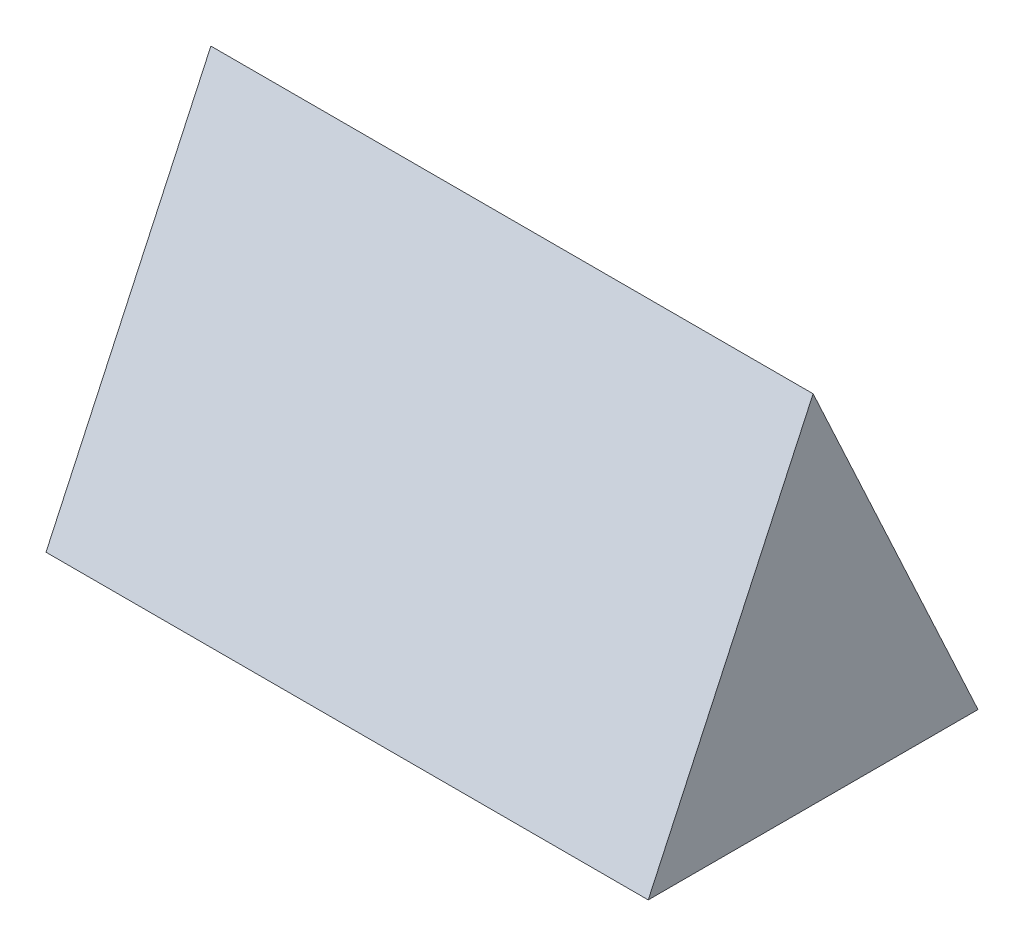
ISO-10303-21;
HEADER;
FILE_DESCRIPTION(('STEP AP214'),'2;1');
FILE_NAME('part.step','',(''),(''),'','','');
FILE_SCHEMA(('AUTOMOTIVE_DESIGN { 1 0 10303 214 1 1 1 1 }'));
ENDSEC;
DATA;
#1=APPLICATION_CONTEXT('core data for automotive mechanical design processes');
#2=APPLICATION_PROTOCOL_DEFINITION('international standard','automotive_design',2000,#1);
#3=PRODUCT_CONTEXT('',#1,'mechanical');
#4=PRODUCT('Part','Part','',(#3));
#5=PRODUCT_RELATED_PRODUCT_CATEGORY('part','',(#4));
#6=PRODUCT_DEFINITION_FORMATION('','',#4);
#7=PRODUCT_DEFINITION_CONTEXT('part definition',#1,'design');
#8=PRODUCT_DEFINITION('design','',#6,#7);
#9=PRODUCT_DEFINITION_SHAPE('','',#8);
#10=(LENGTH_UNIT() NAMED_UNIT(*) SI_UNIT(.MILLI.,.METRE.));
#11=(NAMED_UNIT(*) PLANE_ANGLE_UNIT() SI_UNIT($,.RADIAN.));
#12=(NAMED_UNIT(*) SI_UNIT($,.STERADIAN.) SOLID_ANGLE_UNIT());
#13=UNCERTAINTY_MEASURE_WITH_UNIT(LENGTH_MEASURE(1.E-05),#10,'distance_accuracy_value','');
#14=(GEOMETRIC_REPRESENTATION_CONTEXT(3) GLOBAL_UNCERTAINTY_ASSIGNED_CONTEXT((#13)) GLOBAL_UNIT_ASSIGNED_CONTEXT((#10,
#11,#12)) REPRESENTATION_CONTEXT('',''));
#15=CARTESIAN_POINT('',(0.,0.,0.));
#16=DIRECTION('',(0.,0.,1.));
#17=DIRECTION('',(1.,0.,0.));
#18=AXIS2_PLACEMENT_3D('',#15,#16,#17);
#19=CARTESIAN_POINT('',(-147.,-31.0214859437751,0.));
#20=DIRECTION('',(0.,-1.,0.));
#21=DIRECTION('',(0.,0.,-1.));
#22=AXIS2_PLACEMENT_3D('',#19,#20,#21);
#23=PLANE('',#22);
#24=DIRECTION('',(1.,0.,0.));
#25=VECTOR('',#24,1.);
#26=CARTESIAN_POINT('',(-147.,-31.0214859437751,-75.));
#27=LINE('',#26,#25);
#28=CARTESIAN_POINT('',(-147.,-31.0214859437751,-75.));
#29=VERTEX_POINT('',#28);
#30=CARTESIAN_POINT('',(126.95,-31.0214859437751,-75.));
#31=VERTEX_POINT('',#30);
#32=EDGE_CURVE('E37',#29,#31,#27,.T.);
#33=ORIENTED_EDGE('',*,*,#32,.T.);
#34=DIRECTION('',(0.,0.,-1.));
#35=VECTOR('',#34,1.);
#36=CARTESIAN_POINT('',(126.95,-31.0214859437751,0.));
#37=LINE('',#36,#35);
#38=CARTESIAN_POINT('',(126.95,-31.0214859437751,75.));
#39=VERTEX_POINT('',#38);
#40=EDGE_CURVE('E71',#39,#31,#37,.T.);
#41=ORIENTED_EDGE('',*,*,#40,.F.);
#42=DIRECTION('',(1.,0.,0.));
#43=VECTOR('',#42,1.);
#44=CARTESIAN_POINT('',(-147.,-31.0214859437751,75.));
#45=LINE('',#44,#43);
#46=CARTESIAN_POINT('',(-147.,-31.0214859437751,75.));
#47=VERTEX_POINT('',#46);
#48=EDGE_CURVE('E11',#47,#39,#45,.T.);
#49=ORIENTED_EDGE('',*,*,#48,.F.);
#50=DIRECTION('',(0.,0.,-1.));
#51=VECTOR('',#50,1.);
#52=CARTESIAN_POINT('',(-147.,-31.0214859437751,0.));
#53=LINE('',#52,#51);
#54=EDGE_CURVE('E50',#47,#29,#53,.T.);
#55=ORIENTED_EDGE('',*,*,#54,.T.);
#56=EDGE_LOOP('',(#33,#41,#49,#55));
#57=FACE_BOUND('',#56,.T.);
#58=ADVANCED_FACE('F33',(#57),#23,.T.);
#59=CARTESIAN_POINT('',(-147.,130.878514056225,0.));
#60=DIRECTION('',(0.,0.420337226899562,0.907367960467189));
#61=DIRECTION('',(0.,-0.907367960467189,0.420337226899562));
#62=AXIS2_PLACEMENT_3D('',#59,#60,#61);
#63=PLANE('',#62);
#64=ORIENTED_EDGE('',*,*,#48,.T.);
#65=DIRECTION('',(0.,-0.907367960467189,0.420337226899562));
#66=VECTOR('',#65,1.);
#67=CARTESIAN_POINT('',(126.95,130.878514056225,0.));
#68=LINE('',#67,#66);
#69=CARTESIAN_POINT('',(126.95,130.878514056225,0.));
#70=VERTEX_POINT('',#69);
#71=EDGE_CURVE('E79',#70,#39,#68,.T.);
#72=ORIENTED_EDGE('',*,*,#71,.F.);
#73=DIRECTION('',(1.,0.,0.));
#74=VECTOR('',#73,1.);
#75=CARTESIAN_POINT('',(-147.,130.878514056225,0.));
#76=LINE('',#75,#74);
#77=CARTESIAN_POINT('',(-147.,130.878514056225,0.));
#78=VERTEX_POINT('',#77);
#79=EDGE_CURVE('E42',#78,#70,#76,.T.);
#80=ORIENTED_EDGE('',*,*,#79,.F.);
#81=DIRECTION('',(0.,-0.907367960467189,0.420337226899562));
#82=VECTOR('',#81,1.);
#83=CARTESIAN_POINT('',(-147.,130.878514056225,0.));
#84=LINE('',#83,#82);
#85=EDGE_CURVE('E75',#78,#47,#84,.T.);
#86=ORIENTED_EDGE('',*,*,#85,.T.);
#87=EDGE_LOOP('',(#64,#72,#80,#86));
#88=FACE_BOUND('',#87,.T.);
#89=ADVANCED_FACE('F88',(#88),#63,.T.);
#90=CARTESIAN_POINT('',(-147.,130.878514056225,0.));
#91=DIRECTION('',(0.,0.420337226899562,-0.907367960467189));
#92=DIRECTION('',(0.,0.907367960467189,0.420337226899562));
#93=AXIS2_PLACEMENT_3D('',#90,#91,#92);
#94=PLANE('',#93);
#95=ORIENTED_EDGE('',*,*,#79,.T.);
#96=DIRECTION('',(0.,0.907367960467189,0.420337226899562));
#97=VECTOR('',#96,1.);
#98=CARTESIAN_POINT('',(126.95,130.878514056225,0.));
#99=LINE('',#98,#97);
#100=EDGE_CURVE('E77',#31,#70,#99,.T.);
#101=ORIENTED_EDGE('',*,*,#100,.F.);
#102=ORIENTED_EDGE('',*,*,#32,.F.);
#103=DIRECTION('',(0.,0.907367960467189,0.420337226899562));
#104=VECTOR('',#103,1.);
#105=CARTESIAN_POINT('',(-147.,130.878514056225,0.));
#106=LINE('',#105,#104);
#107=EDGE_CURVE('E86',#29,#78,#106,.T.);
#108=ORIENTED_EDGE('',*,*,#107,.T.);
#109=EDGE_LOOP('',(#95,#101,#102,#108));
#110=FACE_BOUND('',#109,.T.);
#111=ADVANCED_FACE('F35',(#110),#94,.T.);
#112=CARTESIAN_POINT('',(-147.,0.,0.));
#113=DIRECTION('',(-1.,0.,0.));
#114=DIRECTION('',(0.,0.,1.));
#115=AXIS2_PLACEMENT_3D('',#112,#113,#114);
#116=PLANE('',#115);
#117=ORIENTED_EDGE('',*,*,#54,.F.);
#118=ORIENTED_EDGE('',*,*,#85,.F.);
#119=ORIENTED_EDGE('',*,*,#107,.F.);
#120=EDGE_LOOP('',(#117,#118,#119));
#121=FACE_BOUND('',#120,.T.);
#122=ADVANCED_FACE('F89',(#121),#116,.T.);
#123=CARTESIAN_POINT('',(126.95,0.,0.));
#124=DIRECTION('',(-1.,0.,0.));
#125=DIRECTION('',(0.,0.,1.));
#126=AXIS2_PLACEMENT_3D('',#123,#124,#125);
#127=PLANE('',#126);
#128=ORIENTED_EDGE('',*,*,#40,.T.);
#129=ORIENTED_EDGE('',*,*,#100,.T.);
#130=ORIENTED_EDGE('',*,*,#71,.T.);
#131=EDGE_LOOP('',(#128,#129,#130));
#132=FACE_BOUND('',#131,.T.);
#133=ADVANCED_FACE('F81',(#132),#127,.F.);
#134=CLOSED_SHELL('',(#58,#89,#111,#122,#133));
#135=MANIFOLD_SOLID_BREP('B2',#134);
#136=ADVANCED_BREP_SHAPE_REPRESENTATION('',(#18,#135),#14);
#137=SHAPE_DEFINITION_REPRESENTATION(#9,#136);
ENDSEC;
END-ISO-10303-21;
